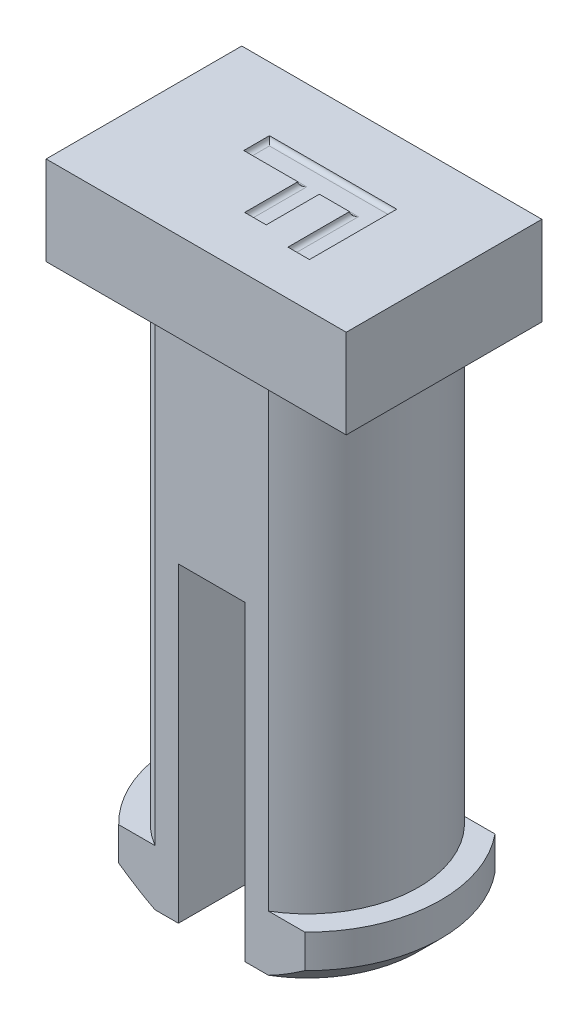
ISO-10303-21;
HEADER;
FILE_DESCRIPTION(('STEP AP214'),'2;1');
FILE_NAME('part.step','',(''),(''),'','','');
FILE_SCHEMA(('AUTOMOTIVE_DESIGN { 1 0 10303 214 1 1 1 1 }'));
ENDSEC;
DATA;
#1=APPLICATION_CONTEXT('core data for automotive mechanical design processes');
#2=APPLICATION_PROTOCOL_DEFINITION('international standard','automotive_design',2000,#1);
#3=PRODUCT_CONTEXT('',#1,'mechanical');
#4=PRODUCT('Part','Part','',(#3));
#5=PRODUCT_RELATED_PRODUCT_CATEGORY('part','',(#4));
#6=PRODUCT_DEFINITION_FORMATION('','',#4);
#7=PRODUCT_DEFINITION_CONTEXT('part definition',#1,'design');
#8=PRODUCT_DEFINITION('design','',#6,#7);
#9=PRODUCT_DEFINITION_SHAPE('','',#8);
#10=(LENGTH_UNIT() NAMED_UNIT(*) SI_UNIT(.MILLI.,.METRE.));
#11=(NAMED_UNIT(*) PLANE_ANGLE_UNIT() SI_UNIT($,.RADIAN.));
#12=(NAMED_UNIT(*) SI_UNIT($,.STERADIAN.) SOLID_ANGLE_UNIT());
#13=UNCERTAINTY_MEASURE_WITH_UNIT(LENGTH_MEASURE(1.E-05),#10,'distance_accuracy_value','');
#14=(GEOMETRIC_REPRESENTATION_CONTEXT(3) GLOBAL_UNCERTAINTY_ASSIGNED_CONTEXT((#13)) GLOBAL_UNIT_ASSIGNED_CONTEXT((#10,
#11,#12)) REPRESENTATION_CONTEXT('',''));
#15=CARTESIAN_POINT('',(0.,0.,0.));
#16=DIRECTION('',(0.,0.,1.));
#17=DIRECTION('',(1.,0.,0.));
#18=AXIS2_PLACEMENT_3D('',#15,#16,#17);
#19=CARTESIAN_POINT('',(3.3750000000002,4.31500000000015,-0.299902035010046));
#20=DIRECTION('',(1.,0.,0.));
#21=DIRECTION('',(0.,-1.,0.));
#22=AXIS2_PLACEMENT_3D('',#19,#20,#21);
#23=PLANE('',#22);
#24=DIRECTION('',(0.,1.,0.));
#25=VECTOR('',#24,1.);
#26=CARTESIAN_POINT('',(3.3750000000002,2.04436866512095,-2.20009796498995));
#27=LINE('',#26,#25);
#28=CARTESIAN_POINT('',(3.3750000000002,4.87500000000014,-2.20009796498995));
#29=VERTEX_POINT('',#28);
#30=CARTESIAN_POINT('',(3.3750000000002,6.87500000000014,-2.20009796498995));
#31=VERTEX_POINT('',#30);
#32=EDGE_CURVE('E419',#29,#31,#27,.T.);
#33=ORIENTED_EDGE('',*,*,#32,.T.);
#34=DIRECTION('',(0.,0.,1.));
#35=VECTOR('',#34,1.);
#36=CARTESIAN_POINT('',(3.3750000000002,6.87500000000014,-2.79990203501005));
#37=LINE('',#36,#35);
#38=CARTESIAN_POINT('',(3.3750000000001,6.87500000000014,2.20009796498994));
#39=VERTEX_POINT('',#38);
#40=EDGE_CURVE('E458',#31,#39,#37,.T.);
#41=ORIENTED_EDGE('',*,*,#40,.T.);
#42=DIRECTION('',(0.,1.,0.));
#43=VECTOR('',#42,1.);
#44=CARTESIAN_POINT('',(3.3750000000001,4.87500000000014,2.20009796498994));
#45=LINE('',#44,#43);
#46=CARTESIAN_POINT('',(3.3750000000002,4.87500000000014,2.20009796498995));
#47=VERTEX_POINT('',#46);
#48=EDGE_CURVE('E11',#47,#39,#45,.T.);
#49=ORIENTED_EDGE('',*,*,#48,.F.);
#50=DIRECTION('',(0.,0.,1.));
#51=VECTOR('',#50,1.);
#52=CARTESIAN_POINT('',(3.3750000000002,4.87500000000014,-2.79990203501005));
#53=LINE('',#52,#51);
#54=EDGE_CURVE('E418',#29,#47,#53,.T.);
#55=ORIENTED_EDGE('',*,*,#54,.F.);
#56=EDGE_LOOP('',(#33,#41,#49,#55));
#57=FACE_BOUND('',#56,.T.);
#58=ADVANCED_FACE('F17',(#57),#23,.T.);
#59=CARTESIAN_POINT('',(4.4100000000002,5.87500000000014,2.20009796498994));
#60=DIRECTION('',(0.,0.,1.));
#61=DIRECTION('',(0.,-1.,0.));
#62=AXIS2_PLACEMENT_3D('',#59,#60,#61);
#63=PLANE('',#62);
#64=DIRECTION('',(-1.,0.,0.));
#65=VECTOR('',#64,1.);
#66=CARTESIAN_POINT('',(3.3750000000001,6.87500000000014,2.20009796498994));
#67=LINE('',#66,#65);
#68=CARTESIAN_POINT('',(-3.3750000000002,6.87500000000014,2.20009796498995));
#69=VERTEX_POINT('',#68);
#70=EDGE_CURVE('E452',#39,#69,#67,.T.);
#71=ORIENTED_EDGE('',*,*,#70,.T.);
#72=DIRECTION('',(0.,1.,0.));
#73=VECTOR('',#72,1.);
#74=CARTESIAN_POINT('',(-3.3750000000002,4.87500000000014,2.20009796498996));
#75=LINE('',#74,#73);
#76=CARTESIAN_POINT('',(-3.3750000000002,4.87500000000014,2.20009796498995));
#77=VERTEX_POINT('',#76);
#78=EDGE_CURVE('E463',#77,#69,#75,.T.);
#79=ORIENTED_EDGE('',*,*,#78,.F.);
#80=DIRECTION('',(-1.,0.,0.));
#81=VECTOR('',#80,1.);
#82=CARTESIAN_POINT('',(3.3750000000002,4.87500000000014,2.20009796498995));
#83=LINE('',#82,#81);
#84=EDGE_CURVE('E511',#47,#77,#83,.T.);
#85=ORIENTED_EDGE('',*,*,#84,.F.);
#86=ORIENTED_EDGE('',*,*,#48,.T.);
#87=EDGE_LOOP('',(#71,#79,#85,#86));
#88=FACE_BOUND('',#87,.T.);
#89=ADVANCED_FACE('F901',(#88),#63,.T.);
#90=CARTESIAN_POINT('',(2.8706971143483,-0.999999999999855,1.85009796498992));
#91=DIRECTION('',(0.,0.,1.));
#92=DIRECTION('',(0.,-1.,0.));
#93=AXIS2_PLACEMENT_3D('',#90,#91,#92);
#94=PLANE('',#93);
#95=DIRECTION('',(0.,1.,0.));
#96=VECTOR('',#95,1.);
#97=CARTESIAN_POINT('',(-1.2757350822175,-5.62499999999985,1.85009796498984));
#98=LINE('',#97,#96);
#99=CARTESIAN_POINT('',(-1.2757350822175,-5.62499999999985,1.85009796498991));
#100=VERTEX_POINT('',#99);
#101=CARTESIAN_POINT('',(-1.2757350822175,4.87500000000014,1.85009796498984));
#102=VERTEX_POINT('',#101);
#103=EDGE_CURVE('E469',#100,#102,#98,.T.);
#104=ORIENTED_EDGE('',*,*,#103,.F.);
#105=DIRECTION('',(1.,0.,0.));
#106=VECTOR('',#105,1.);
#107=CARTESIAN_POINT('',(-2.0922475952909,-5.62499999999985,1.85009796498991));
#108=LINE('',#107,#106);
#109=CARTESIAN_POINT('',(-2.0922475952909,-5.62499999999985,1.85009796498992));
#110=VERTEX_POINT('',#109);
#111=EDGE_CURVE('E325',#110,#100,#108,.T.);
#112=ORIENTED_EDGE('',*,*,#111,.F.);
#113=DIRECTION('',(0.,1.,0.));
#114=VECTOR('',#113,1.);
#115=CARTESIAN_POINT('',(-2.0922475952909,-6.37499999999985,1.85009796498992));
#116=LINE('',#115,#114);
#117=CARTESIAN_POINT('',(-2.0922475952909,-6.37499999999985,1.85009796498994));
#118=VERTEX_POINT('',#117);
#119=EDGE_CURVE('E183',#118,#110,#116,.T.);
#120=ORIENTED_EDGE('',*,*,#119,.F.);
#121=CARTESIAN_POINT('',(-1.27573508221749,-6.87499999999999,1.85009796498994));
#122=CARTESIAN_POINT('',(-1.64687713360691,-6.68560842582256,1.85009796498994));
#123=CARTESIAN_POINT('',(-2.09224759527229,-6.37500000001307,1.85009796498994));
#124=(BOUNDED_CURVE() B_SPLINE_CURVE(2,(#121,#122,#123),.UNSPECIFIED.,.F.,
.F.) B_SPLINE_CURVE_WITH_KNOTS((3,3),(2.63089652868955,2.93477671960764),
.UNSPECIFIED.) CURVE() GEOMETRIC_REPRESENTATION_ITEM() RATIONAL_B_SPLINE_CURVE((3.74193548387105,
3.59549330391969,3.37864077670762)) REPRESENTATION_ITEM(''));
#125=CARTESIAN_POINT('',(-1.2757350822175,-6.87499999999985,1.85009796498989));
#126=VERTEX_POINT('',#125);
#127=EDGE_CURVE('E486',#126,#118,#124,.T.);
#128=ORIENTED_EDGE('',*,*,#127,.F.);
#129=DIRECTION('',(-1.,0.,0.));
#130=VECTOR('',#129,1.);
#131=CARTESIAN_POINT('',(-0.749999999999799,-6.87499999999985,1.85009796498992));
#132=LINE('',#131,#130);
#133=CARTESIAN_POINT('',(-0.749999999999799,-6.87499999999985,1.85009796498992));
#134=VERTEX_POINT('',#133);
#135=EDGE_CURVE('E402',#134,#126,#132,.T.);
#136=ORIENTED_EDGE('',*,*,#135,.F.);
#137=DIRECTION('',(0.,-1.,0.));
#138=VECTOR('',#137,1.);
#139=CARTESIAN_POINT('',(-0.749999999999799,0.125000000000146,1.85009796498992));
#140=LINE('',#139,#138);
#141=CARTESIAN_POINT('',(-0.749999999999799,0.125000000000146,1.85009796498992));
#142=VERTEX_POINT('',#141);
#143=EDGE_CURVE('E497',#142,#134,#140,.T.);
#144=ORIENTED_EDGE('',*,*,#143,.F.);
#145=DIRECTION('',(-1.,0.,0.));
#146=VECTOR('',#145,1.);
#147=CARTESIAN_POINT('',(0.750000000000202,0.125000000000146,1.85009796498992));
#148=LINE('',#147,#146);
#149=CARTESIAN_POINT('',(0.750000000000202,0.125000000000146,1.85009796498992));
#150=VERTEX_POINT('',#149);
#151=EDGE_CURVE('E520',#150,#142,#148,.T.);
#152=ORIENTED_EDGE('',*,*,#151,.F.);
#153=DIRECTION('',(0.,1.,0.));
#154=VECTOR('',#153,1.);
#155=CARTESIAN_POINT('',(0.750000000000202,-6.87499999999985,1.85009796498992));
#156=LINE('',#155,#154);
#157=CARTESIAN_POINT('',(0.750000000000202,-6.87499999999985,1.85009796498997));
#158=VERTEX_POINT('',#157);
#159=EDGE_CURVE('E72',#158,#150,#156,.T.);
#160=ORIENTED_EDGE('',*,*,#159,.F.);
#161=DIRECTION('',(-1.,0.,0.));
#162=VECTOR('',#161,1.);
#163=CARTESIAN_POINT('',(1.2757350822172,-6.87499999999985,1.85009796498997));
#164=LINE('',#163,#162);
#165=CARTESIAN_POINT('',(1.2757350822172,-6.87499999999985,1.85009796498997));
#166=VERTEX_POINT('',#165);
#167=EDGE_CURVE('E369',#166,#158,#164,.T.);
#168=ORIENTED_EDGE('',*,*,#167,.F.);
#169=CARTESIAN_POINT('',(2.09224759527189,-6.37500000001286,1.85009796498995));
#170=CARTESIAN_POINT('',(1.64687713360649,-6.68560842582246,1.85009796498995));
#171=CARTESIAN_POINT('',(1.2757350822171,-6.87499999999985,1.85009796498995));
#172=(BOUNDED_CURVE() B_SPLINE_CURVE(2,(#169,#170,#171),.UNSPECIFIED.,.F.,
.F.) B_SPLINE_CURVE_WITH_KNOTS((3,3),(1.06297264722392,1.36685283814203),
.UNSPECIFIED.) CURVE() GEOMETRIC_REPRESENTATION_ITEM() RATIONAL_B_SPLINE_CURVE((3.3786407767078,
3.59549330391984,3.74193548387118)) REPRESENTATION_ITEM(''));
#173=CARTESIAN_POINT('',(2.0922475952905,-6.37500000000005,1.85009796499042));
#174=VERTEX_POINT('',#173);
#175=EDGE_CURVE('E519',#174,#166,#172,.T.);
#176=ORIENTED_EDGE('',*,*,#175,.F.);
#177=DIRECTION('',(0.,-1.,0.));
#178=VECTOR('',#177,1.);
#179=CARTESIAN_POINT('',(2.0922475952905,-5.62499999999985,1.85009796499042));
#180=LINE('',#179,#178);
#181=CARTESIAN_POINT('',(2.0922475952905,-5.62499999999985,1.85009796499042));
#182=VERTEX_POINT('',#181);
#183=EDGE_CURVE('E504',#182,#174,#180,.T.);
#184=ORIENTED_EDGE('',*,*,#183,.F.);
#185=DIRECTION('',(1.,0.,0.));
#186=VECTOR('',#185,1.);
#187=CARTESIAN_POINT('',(1.2757350822172,-5.62499999999985,1.85009796498998));
#188=LINE('',#187,#186);
#189=CARTESIAN_POINT('',(1.2757350822172,-5.62499999999985,1.85009796498998));
#190=VERTEX_POINT('',#189);
#191=EDGE_CURVE('E440',#190,#182,#188,.T.);
#192=ORIENTED_EDGE('',*,*,#191,.F.);
#193=DIRECTION('',(0.,-1.,0.));
#194=VECTOR('',#193,1.);
#195=CARTESIAN_POINT('',(1.2757350822173,4.87500000000014,1.85009796499007));
#196=LINE('',#195,#194);
#197=CARTESIAN_POINT('',(1.2757350822173,4.87500000000014,1.85009796499007));
#198=VERTEX_POINT('',#197);
#199=EDGE_CURVE('E88',#198,#190,#196,.T.);
#200=ORIENTED_EDGE('',*,*,#199,.F.);
#201=DIRECTION('',(-1.,0.,0.));
#202=VECTOR('',#201,1.);
#203=CARTESIAN_POINT('',(1.2757350822172,4.87500000000014,1.85009796498992));
#204=LINE('',#203,#202);
#205=EDGE_CURVE('E27',#198,#102,#204,.T.);
#206=ORIENTED_EDGE('',*,*,#205,.T.);
#207=EDGE_LOOP('',(#104,#112,#120,#128,#136,#144,#152,#160,#168,#176,#184,#192,#200,#206));
#208=FACE_BOUND('',#207,.T.);
#209=ADVANCED_FACE('F904',(#208),#94,.T.);
#210=CARTESIAN_POINT('',(-2.1753675411088,4.87500000000014,-3.23990203501003));
#211=DIRECTION('',(0.,-1.,0.));
#212=DIRECTION('',(-1.,0.,0.));
#213=AXIS2_PLACEMENT_3D('',#210,#211,#212);
#214=PLANE('',#213);
#215=DIRECTION('',(1.,0.,0.));
#216=VECTOR('',#215,1.);
#217=CARTESIAN_POINT('',(0.675099267685303,4.87500000000014,-2.20009796498995));
#218=LINE('',#217,#216);
#219=CARTESIAN_POINT('',(1.6245785384796,4.87500000000014,-2.20009796498995));
#220=VERTEX_POINT('',#219);
#221=EDGE_CURVE('E424',#220,#29,#218,.T.);
#222=ORIENTED_EDGE('',*,*,#221,.T.);
#223=ORIENTED_EDGE('',*,*,#54,.T.);
#224=ORIENTED_EDGE('',*,*,#84,.T.);
#225=DIRECTION('',(0.,0.,-1.));
#226=VECTOR('',#225,1.);
#227=CARTESIAN_POINT('',(-3.3750000000002,4.87500000000014,2.20009796498996));
#228=LINE('',#227,#226);
#229=CARTESIAN_POINT('',(-3.3750000000002,4.87500000000014,-2.20009796498995));
#230=VERTEX_POINT('',#229);
#231=EDGE_CURVE('E461',#77,#230,#228,.T.);
#232=ORIENTED_EDGE('',*,*,#231,.T.);
#233=DIRECTION('',(1.,0.,0.));
#234=VECTOR('',#233,1.);
#235=CARTESIAN_POINT('',(0.675099267685303,4.87500000000014,-2.20009796498995));
#236=LINE('',#235,#234);
#237=CARTESIAN_POINT('',(-1.6245785384795,4.87500000000014,-2.20009796498995));
#238=VERTEX_POINT('',#237);
#239=EDGE_CURVE('E395',#230,#238,#236,.T.);
#240=ORIENTED_EDGE('',*,*,#239,.T.);
#241=CARTESIAN_POINT('',(-3.98986399474666E-13,4.87500000000014,-0.299902035010056));
#242=DIRECTION('',(0.,-1.,0.));
#243=DIRECTION('',(-0.510294032886866,0.,-0.860000000000034));
#244=AXIS2_PLACEMENT_3D('',#241,#242,#243);
#245=CIRCLE('',#244,2.4999999999998);
#246=EDGE_CURVE('E475',#102,#238,#245,.T.);
#247=ORIENTED_EDGE('',*,*,#246,.F.);
#248=ORIENTED_EDGE('',*,*,#205,.F.);
#249=CARTESIAN_POINT('',(2.0122792321331E-13,4.87500000000014,-0.299902035010056));
#250=DIRECTION('',(0.,-1.,0.));
#251=DIRECTION('',(0.510294032886823,0.,0.86000000000006));
#252=AXIS2_PLACEMENT_3D('',#249,#250,#251);
#253=CIRCLE('',#252,2.5);
#254=EDGE_CURVE('E524',#220,#198,#253,.T.);
#255=ORIENTED_EDGE('',*,*,#254,.F.);
#256=EDGE_LOOP('',(#222,#223,#224,#232,#240,#247,#248,#255));
#257=FACE_BOUND('',#256,.T.);
#258=ADVANCED_FACE('F917',(#257),#214,.T.);
#259=CARTESIAN_POINT('',(0.750000000000202,-7.93499999999985,-0.299902035010056));
#260=DIRECTION('',(-1.,0.,0.));
#261=DIRECTION('',(0.,0.,1.));
#262=AXIS2_PLACEMENT_3D('',#259,#260,#261);
#263=PLANE('',#262);
#264=DIRECTION('',(0.,-1.,0.));
#265=VECTOR('',#264,1.);
#266=CARTESIAN_POINT('',(0.750000000000202,-4.08063133487905,-2.20009796498995));
#267=LINE('',#266,#265);
#268=CARTESIAN_POINT('',(0.750000000000202,0.125000000000146,-2.20009796498995));
#269=VERTEX_POINT('',#268);
#270=CARTESIAN_POINT('',(0.750000000000202,-6.87499999999985,-2.20009796498995));
#271=VERTEX_POINT('',#270);
#272=EDGE_CURVE('E357',#269,#271,#267,.T.);
#273=ORIENTED_EDGE('',*,*,#272,.T.);
#274=DIRECTION('',(0.,0.,-1.));
#275=VECTOR('',#274,1.);
#276=CARTESIAN_POINT('',(0.750000000000202,-6.87499999999985,1.85009796498992));
#277=LINE('',#276,#275);
#278=EDGE_CURVE('E373',#158,#271,#277,.T.);
#279=ORIENTED_EDGE('',*,*,#278,.F.);
#280=ORIENTED_EDGE('',*,*,#159,.T.);
#281=DIRECTION('',(0.,0.,1.));
#282=VECTOR('',#281,1.);
#283=CARTESIAN_POINT('',(0.750000000000202,0.125000000000146,-2.44990203501003));
#284=LINE('',#283,#282);
#285=EDGE_CURVE('E513',#269,#150,#284,.T.);
#286=ORIENTED_EDGE('',*,*,#285,.F.);
#287=EDGE_LOOP('',(#273,#279,#280,#286));
#288=FACE_BOUND('',#287,.T.);
#289=ADVANCED_FACE('F936',(#288),#263,.T.);
#290=CARTESIAN_POINT('',(2.0122792321331E-13,-6.67619999999975,-0.299902035010416));
#291=DIRECTION('',(0.,-1.,0.));
#292=DIRECTION('',(0.,0.,1.));
#293=AXIS2_PLACEMENT_3D('',#290,#291,#292);
#294=CYLINDRICAL_SURFACE('',#293,2.50000000000035);
#295=DIRECTION('',(0.,1.,0.));
#296=VECTOR('',#295,1.);
#297=CARTESIAN_POINT('',(1.6245785384806,-6.67619999999975,-2.20009796498995));
#298=LINE('',#297,#296);
#299=CARTESIAN_POINT('',(1.6245785384795,-5.62499999999985,-2.20009796498995));
#300=VERTEX_POINT('',#299);
#301=EDGE_CURVE('E428',#300,#220,#298,.T.);
#302=ORIENTED_EDGE('',*,*,#301,.T.);
#303=ORIENTED_EDGE('',*,*,#254,.T.);
#304=ORIENTED_EDGE('',*,*,#199,.T.);
#305=CARTESIAN_POINT('',(3.98986399474666E-13,-5.62499999999985,-0.299902035010056));
#306=DIRECTION('',(0.,-1.,0.));
#307=DIRECTION('',(0.510294032886748,0.,0.860000000000104));
#308=AXIS2_PLACEMENT_3D('',#305,#306,#307);
#309=CIRCLE('',#308,2.49999999999975);
#310=EDGE_CURVE('E433',#300,#190,#309,.T.);
#311=ORIENTED_EDGE('',*,*,#310,.F.);
#312=EDGE_LOOP('',(#302,#303,#304,#311));
#313=FACE_BOUND('',#312,.T.);
#314=ADVANCED_FACE('F922',(#313),#294,.T.);
#315=CARTESIAN_POINT('',(2.0122792321331E-13,-9.04487999999985,-0.299902035010066));
#316=DIRECTION('',(-1.00968571592498E-13,1.,0.));
#317=DIRECTION('',(0.996311320213211,1.00710866506472E-13,0.0858123138891406));
#318=AXIS2_PLACEMENT_3D('',#315,#316,#317);
#319=CONICAL_SURFACE('',#318,0.330119999999992,0.785398163397457);
#320=CARTESIAN_POINT('',(1.6245785384788,-6.87500000000015,-2.20009796498995));
#321=CARTESIAN_POINT('',(1.94135056313009,-6.66915158686443,-2.20009796498995));
#322=CARTESIAN_POINT('',(2.3214769927109,-6.37499999999995,-2.20009796498995));
#323=(BOUNDED_CURVE() B_SPLINE_CURVE(2,(#320,#321,#322),.UNSPECIFIED.,.F.,
.F.) B_SPLINE_CURVE_WITH_KNOTS((3,3),(0.,0.0857889296771792),
.UNSPECIFIED.) CURVE() GEOMETRIC_REPRESENTATION_ITEM() RATIONAL_B_SPLINE_CURVE((1.,
1.0081255355786,1.)) REPRESENTATION_ITEM(''));
#324=CARTESIAN_POINT('',(1.6245785384794,-6.87499999999985,-2.20009796498995));
#325=VERTEX_POINT('',#324);
#326=CARTESIAN_POINT('',(2.3214769927115,-6.37500000000005,-2.20009796498995));
#327=VERTEX_POINT('',#326);
#328=EDGE_CURVE('E445',#325,#327,#323,.T.);
#329=ORIENTED_EDGE('',*,*,#328,.T.);
#330=CARTESIAN_POINT('',(2.0122792321331E-13,-6.37500000000005,-0.299902035010076));
#331=DIRECTION('',(0.,1.,0.));
#332=DIRECTION('',(0.697415865096755,0.,-0.716666666666829));
#333=AXIS2_PLACEMENT_3D('',#330,#331,#332);
#334=CIRCLE('',#333,3.);
#335=EDGE_CURVE('E397',#174,#327,#334,.T.);
#336=ORIENTED_EDGE('',*,*,#335,.F.);
#337=ORIENTED_EDGE('',*,*,#175,.T.);
#338=CARTESIAN_POINT('',(4.9960036108132E-13,-6.87499999999985,-0.299902035010056));
#339=DIRECTION('',(0.,-1.,0.));
#340=DIRECTION('',(0.510294032886745,0.,0.860000000000106));
#341=AXIS2_PLACEMENT_3D('',#338,#339,#340);
#342=CIRCLE('',#341,2.49999999999973);
#343=EDGE_CURVE('E372',#325,#166,#342,.T.);
#344=ORIENTED_EDGE('',*,*,#343,.F.);
#345=EDGE_LOOP('',(#329,#336,#337,#344));
#346=FACE_BOUND('',#345,.T.);
#347=ADVANCED_FACE('F934',(#346),#319,.T.);
#348=CARTESIAN_POINT('',(2.0122792321331E-13,0.125000000000146,-3.23990203501003));
#349=DIRECTION('',(0.,-1.,0.));
#350=DIRECTION('',(-1.,0.,0.));
#351=AXIS2_PLACEMENT_3D('',#348,#349,#350);
#352=PLANE('',#351);
#353=DIRECTION('',(1.,0.,0.));
#354=VECTOR('',#353,1.);
#355=CARTESIAN_POINT('',(1.7627830382399,0.125000000000146,-2.20009796498995));
#356=LINE('',#355,#354);
#357=CARTESIAN_POINT('',(-0.749999999999799,0.125000000000146,-2.20009796498995));
#358=VERTEX_POINT('',#357);
#359=EDGE_CURVE('E349',#358,#269,#356,.T.);
#360=ORIENTED_EDGE('',*,*,#359,.T.);
#361=ORIENTED_EDGE('',*,*,#285,.T.);
#362=ORIENTED_EDGE('',*,*,#151,.T.);
#363=DIRECTION('',(0.,0.,-1.));
#364=VECTOR('',#363,1.);
#365=CARTESIAN_POINT('',(-0.749999999999799,0.125000000000146,1.85009796498992));
#366=LINE('',#365,#364);
#367=EDGE_CURVE('E407',#142,#358,#366,.T.);
#368=ORIENTED_EDGE('',*,*,#367,.T.);
#369=EDGE_LOOP('',(#360,#361,#362,#368));
#370=FACE_BOUND('',#369,.T.);
#371=ADVANCED_FACE('F942',(#370),#352,.T.);
#372=CARTESIAN_POINT('',(2.1378675411087,-5.62499999999985,-3.23990203501028));
#373=DIRECTION('',(0.,1.,0.));
#374=DIRECTION('',(0.,0.,-1.));
#375=AXIS2_PLACEMENT_3D('',#372,#373,#374);
#376=PLANE('',#375);
#377=DIRECTION('',(-1.,0.,0.));
#378=VECTOR('',#377,1.);
#379=CARTESIAN_POINT('',(2.8317168087941,-5.62499999999985,-2.20009796498995));
#380=LINE('',#379,#378);
#381=CARTESIAN_POINT('',(2.3214769927115,-5.62499999999985,-2.20009796498995));
#382=VERTEX_POINT('',#381);
#383=EDGE_CURVE('E435',#382,#300,#380,.T.);
#384=ORIENTED_EDGE('',*,*,#383,.T.);
#385=ORIENTED_EDGE('',*,*,#310,.T.);
#386=ORIENTED_EDGE('',*,*,#191,.T.);
#387=CARTESIAN_POINT('',(2.0122792321331E-13,-5.62499999999985,-0.299902035010066));
#388=DIRECTION('',(0.,-1.,0.));
#389=DIRECTION('',(0.697415865096753,0.,0.716666666666831));
#390=AXIS2_PLACEMENT_3D('',#387,#388,#389);
#391=CIRCLE('',#390,3.);
#392=EDGE_CURVE('E496',#382,#182,#391,.T.);
#393=ORIENTED_EDGE('',*,*,#392,.F.);
#394=EDGE_LOOP('',(#384,#385,#386,#393));
#395=FACE_BOUND('',#394,.T.);
#396=ADVANCED_FACE('F926',(#395),#376,.T.);
#397=CARTESIAN_POINT('',(1.6250000000002,-6.87499999999985,-3.2399020350101));
#398=DIRECTION('',(0.,-1.,0.));
#399=DIRECTION('',(-1.,0.,0.));
#400=AXIS2_PLACEMENT_3D('',#397,#398,#399);
#401=PLANE('',#400);
#402=DIRECTION('',(1.,0.,0.));
#403=VECTOR('',#402,1.);
#404=CARTESIAN_POINT('',(2.5752830382399,-6.87499999999985,-2.20009796498995));
#405=LINE('',#404,#403);
#406=EDGE_CURVE('E365',#271,#325,#405,.T.);
#407=ORIENTED_EDGE('',*,*,#406,.T.);
#408=ORIENTED_EDGE('',*,*,#343,.T.);
#409=ORIENTED_EDGE('',*,*,#167,.T.);
#410=ORIENTED_EDGE('',*,*,#278,.T.);
#411=EDGE_LOOP('',(#407,#408,#409,#410));
#412=FACE_BOUND('',#411,.T.);
#413=ADVANCED_FACE('F940',(#412),#401,.T.);
#414=CARTESIAN_POINT('',(2.0122792321331E-13,-6.45119999999985,-0.299902035010406));
#415=DIRECTION('',(0.,-1.,0.));
#416=DIRECTION('',(0.,0.,1.));
#417=AXIS2_PLACEMENT_3D('',#414,#415,#416);
#418=CYLINDRICAL_SURFACE('',#417,3.00000000000034);
#419=DIRECTION('',(0.,1.,0.));
#420=VECTOR('',#419,1.);
#421=CARTESIAN_POINT('',(2.3214769927122,-6.45119999999985,-2.20009796498995));
#422=LINE('',#421,#420);
#423=EDGE_CURVE('E442',#327,#382,#422,.T.);
#424=ORIENTED_EDGE('',*,*,#423,.T.);
#425=ORIENTED_EDGE('',*,*,#392,.T.);
#426=ORIENTED_EDGE('',*,*,#183,.T.);
#427=ORIENTED_EDGE('',*,*,#335,.T.);
#428=EDGE_LOOP('',(#424,#425,#426,#427));
#429=FACE_BOUND('',#428,.T.);
#430=ADVANCED_FACE('F927',(#429),#418,.T.);
#431=CARTESIAN_POINT('',(-0.749999999999799,-7.93499999999985,-0.299902035010056));
#432=DIRECTION('',(1.,0.,0.));
#433=DIRECTION('',(0.,-1.,0.));
#434=AXIS2_PLACEMENT_3D('',#431,#432,#433);
#435=PLANE('',#434);
#436=DIRECTION('',(0.,1.,0.));
#437=VECTOR('',#436,1.);
#438=CARTESIAN_POINT('',(-0.749999999999799,-4.08063133487905,-2.20009796498995));
#439=LINE('',#438,#437);
#440=CARTESIAN_POINT('',(-0.749999999999799,-6.87499999999985,-2.20009796498995));
#441=VERTEX_POINT('',#440);
#442=EDGE_CURVE('E353',#441,#358,#439,.T.);
#443=ORIENTED_EDGE('',*,*,#442,.T.);
#444=ORIENTED_EDGE('',*,*,#367,.F.);
#445=ORIENTED_EDGE('',*,*,#143,.T.);
#446=DIRECTION('',(0.,0.,1.));
#447=VECTOR('',#446,1.);
#448=CARTESIAN_POINT('',(-0.749999999999799,-6.87499999999985,-2.44990203501003));
#449=LINE('',#448,#447);
#450=EDGE_CURVE('E408',#441,#134,#449,.T.);
#451=ORIENTED_EDGE('',*,*,#450,.F.);
#452=EDGE_LOOP('',(#443,#444,#445,#451));
#453=FACE_BOUND('',#452,.T.);
#454=ADVANCED_FACE('F946',(#453),#435,.T.);
#455=CARTESIAN_POINT('',(-1.625,-6.87499999999985,-3.23990203501003));
#456=DIRECTION('',(0.,-1.,0.));
#457=DIRECTION('',(-1.,0.,0.));
#458=AXIS2_PLACEMENT_3D('',#455,#456,#457);
#459=PLANE('',#458);
#460=DIRECTION('',(1.,0.,0.));
#461=VECTOR('',#460,1.);
#462=CARTESIAN_POINT('',(0.950283038239701,-6.87499999999985,-2.20009796498995));
#463=LINE('',#462,#461);
#464=CARTESIAN_POINT('',(-1.6245785384796,-6.87499999999985,-2.20009796498995));
#465=VERTEX_POINT('',#464);
#466=EDGE_CURVE('E358',#465,#441,#463,.T.);
#467=ORIENTED_EDGE('',*,*,#466,.T.);
#468=ORIENTED_EDGE('',*,*,#450,.T.);
#469=ORIENTED_EDGE('',*,*,#135,.T.);
#470=CARTESIAN_POINT('',(-2.98372437868011E-13,-6.87499999999985,-0.299902035010056));
#471=DIRECTION('',(0.,1.,0.));
#472=DIRECTION('',(-0.510294032886918,0.,0.86));
#473=AXIS2_PLACEMENT_3D('',#470,#471,#472);
#474=CIRCLE('',#473,2.49999999999993);
#475=EDGE_CURVE('E485',#465,#126,#474,.T.);
#476=ORIENTED_EDGE('',*,*,#475,.F.);
#477=EDGE_LOOP('',(#467,#468,#469,#476));
#478=FACE_BOUND('',#477,.T.);
#479=ADVANCED_FACE('F955',(#478),#459,.T.);
#480=CARTESIAN_POINT('',(2.0122792321331E-13,-9.04487999999985,-0.299902035010066));
#481=DIRECTION('',(-1.00968571592498E-13,1.,0.));
#482=DIRECTION('',(-0.581108581114928,0.,-0.813826036051069));
#483=AXIS2_PLACEMENT_3D('',#480,#481,#482);
#484=CONICAL_SURFACE('',#483,0.330119999999992,0.785398163397457);
#485=CARTESIAN_POINT('',(-2.3214769927119,-6.37499999999985,-2.20009796498995));
#486=CARTESIAN_POINT('',(-1.94135056313139,-6.66915158686402,-2.20009796498995));
#487=CARTESIAN_POINT('',(-1.6245785384796,-6.87499999999995,-2.20009796498995));
#488=(BOUNDED_CURVE() B_SPLINE_CURVE(2,(#485,#486,#487),.UNSPECIFIED.,.F.,
.F.) B_SPLINE_CURVE_WITH_KNOTS((3,3),(0.,0.0857889296771956),
.UNSPECIFIED.) CURVE() GEOMETRIC_REPRESENTATION_ITEM() RATIONAL_B_SPLINE_CURVE((1.,
1.00812553556989,1.)) REPRESENTATION_ITEM(''));
#489=CARTESIAN_POINT('',(-2.3214769927115,-6.37499999999985,-2.20009796498995));
#490=VERTEX_POINT('',#489);
#491=EDGE_CURVE('E366',#490,#465,#488,.T.);
#492=ORIENTED_EDGE('',*,*,#491,.T.);
#493=ORIENTED_EDGE('',*,*,#475,.T.);
#494=ORIENTED_EDGE('',*,*,#127,.T.);
#495=CARTESIAN_POINT('',(-4.9960036108132E-13,-6.37499999999995,-0.299902035010066));
#496=DIRECTION('',(0.,-1.,0.));
#497=DIRECTION('',(-0.697415865096868,0.,-0.71666666666672));
#498=AXIS2_PLACEMENT_3D('',#495,#496,#497);
#499=CIRCLE('',#498,2.99999999999978);
#500=EDGE_CURVE('E317',#118,#490,#499,.T.);
#501=ORIENTED_EDGE('',*,*,#500,.T.);
#502=EDGE_LOOP('',(#492,#493,#494,#501));
#503=FACE_BOUND('',#502,.T.);
#504=ADVANCED_FACE('F954',(#503),#484,.T.);
#505=CARTESIAN_POINT('',(2.0122792321331E-13,-6.45119999999985,-0.299902035010406));
#506=DIRECTION('',(0.,-1.,0.));
#507=DIRECTION('',(0.,0.,1.));
#508=AXIS2_PLACEMENT_3D('',#505,#506,#507);
#509=CYLINDRICAL_SURFACE('',#508,3.00000000000034);
#510=DIRECTION('',(0.,-1.,0.));
#511=VECTOR('',#510,1.);
#512=CARTESIAN_POINT('',(-2.3214769927118,-6.45119999999985,-2.20009796498995));
#513=LINE('',#512,#511);
#514=CARTESIAN_POINT('',(-2.3214769927114,-5.62499999999985,-2.20009796498995));
#515=VERTEX_POINT('',#514);
#516=EDGE_CURVE('E379',#515,#490,#513,.T.);
#517=ORIENTED_EDGE('',*,*,#516,.T.);
#518=ORIENTED_EDGE('',*,*,#500,.F.);
#519=ORIENTED_EDGE('',*,*,#119,.T.);
#520=CARTESIAN_POINT('',(-4.9960036108132E-13,-5.62499999999985,-0.299902035010046));
#521=DIRECTION('',(0.,-1.,0.));
#522=DIRECTION('',(-0.69741586509687,0.,-0.716666666666718));
#523=AXIS2_PLACEMENT_3D('',#520,#521,#522);
#524=CIRCLE('',#523,2.99999999999974);
#525=EDGE_CURVE('E480',#110,#515,#524,.T.);
#526=ORIENTED_EDGE('',*,*,#525,.T.);
#527=EDGE_LOOP('',(#517,#518,#519,#526));
#528=FACE_BOUND('',#527,.T.);
#529=ADVANCED_FACE('F956',(#528),#509,.T.);
#530=CARTESIAN_POINT('',(-2.1378675411088,-5.62499999999985,-3.23990203501003));
#531=DIRECTION('',(0.,1.,0.));
#532=DIRECTION('',(0.,0.,-1.));
#533=AXIS2_PLACEMENT_3D('',#530,#531,#532);
#534=PLANE('',#533);
#535=DIRECTION('',(-1.,0.,0.));
#536=VECTOR('',#535,1.);
#537=CARTESIAN_POINT('',(0.693849267685401,-5.62499999999985,-2.20009796498995));
#538=LINE('',#537,#536);
#539=CARTESIAN_POINT('',(-1.6245785384795,-5.62499999999985,-2.20009796498995));
#540=VERTEX_POINT('',#539);
#541=EDGE_CURVE('E390',#540,#515,#538,.T.);
#542=ORIENTED_EDGE('',*,*,#541,.T.);
#543=ORIENTED_EDGE('',*,*,#525,.F.);
#544=ORIENTED_EDGE('',*,*,#111,.T.);
#545=CARTESIAN_POINT('',(-2.98372437868011E-13,-5.62499999999985,-0.299902035010056));
#546=DIRECTION('',(0.,-1.,0.));
#547=DIRECTION('',(-0.510294032886886,0.,-0.860000000000022));
#548=AXIS2_PLACEMENT_3D('',#545,#546,#547);
#549=CIRCLE('',#548,2.49999999999988);
#550=EDGE_CURVE('E470',#100,#540,#549,.T.);
#551=ORIENTED_EDGE('',*,*,#550,.T.);
#552=EDGE_LOOP('',(#542,#543,#544,#551));
#553=FACE_BOUND('',#552,.T.);
#554=ADVANCED_FACE('F961',(#553),#534,.T.);
#555=CARTESIAN_POINT('',(2.0122792321331E-13,-6.67619999999975,-0.299902035010416));
#556=DIRECTION('',(0.,-1.,0.));
#557=DIRECTION('',(0.,0.,1.));
#558=AXIS2_PLACEMENT_3D('',#555,#556,#557);
#559=CYLINDRICAL_SURFACE('',#558,2.50000000000035);
#560=DIRECTION('',(0.,-1.,0.));
#561=VECTOR('',#560,1.);
#562=CARTESIAN_POINT('',(-1.6245785384802,-6.67619999999975,-2.20009796498995));
#563=LINE('',#562,#561);
#564=EDGE_CURVE('E391',#238,#540,#563,.T.);
#565=ORIENTED_EDGE('',*,*,#564,.T.);
#566=ORIENTED_EDGE('',*,*,#550,.F.);
#567=ORIENTED_EDGE('',*,*,#103,.T.);
#568=ORIENTED_EDGE('',*,*,#246,.T.);
#569=EDGE_LOOP('',(#565,#566,#567,#568));
#570=FACE_BOUND('',#569,.T.);
#571=ADVANCED_FACE('F962',(#570),#559,.T.);
#572=CARTESIAN_POINT('',(-3.3750000000002,4.31500000000015,-0.299902035010036));
#573=DIRECTION('',(-1.,0.,0.));
#574=DIRECTION('',(0.,0.,1.));
#575=AXIS2_PLACEMENT_3D('',#572,#573,#574);
#576=PLANE('',#575);
#577=DIRECTION('',(0.,-1.,0.));
#578=VECTOR('',#577,1.);
#579=CARTESIAN_POINT('',(-3.3750000000002,2.04436866512095,-2.20009796498995));
#580=LINE('',#579,#578);
#581=CARTESIAN_POINT('',(-3.3750000000002,6.87500000000014,-2.20009796498995));
#582=VERTEX_POINT('',#581);
#583=EDGE_CURVE('E403',#582,#230,#580,.T.);
#584=ORIENTED_EDGE('',*,*,#583,.T.);
#585=ORIENTED_EDGE('',*,*,#231,.F.);
#586=ORIENTED_EDGE('',*,*,#78,.T.);
#587=DIRECTION('',(0.,0.,-1.));
#588=VECTOR('',#587,1.);
#589=CARTESIAN_POINT('',(-3.3750000000002,6.87500000000014,2.20009796498995));
#590=LINE('',#589,#588);
#591=EDGE_CURVE('E361',#69,#582,#590,.T.);
#592=ORIENTED_EDGE('',*,*,#591,.T.);
#593=EDGE_LOOP('',(#584,#585,#586,#592));
#594=FACE_BOUND('',#593,.T.);
#595=ADVANCED_FACE('F968',(#594),#576,.T.);
#596=CARTESIAN_POINT('',(0.,6.87500000000014,-3.23990203501004));
#597=DIRECTION('',(0.,1.,0.));
#598=DIRECTION('',(0.,0.,-1.));
#599=AXIS2_PLACEMENT_3D('',#596,#597,#598);
#600=PLANE('',#599);
#601=DIRECTION('',(-1.,0.,0.));
#602=VECTOR('',#601,1.);
#603=CARTESIAN_POINT('',(-0.0501659079302982,6.87500000000014,-0.186748345270606));
#604=LINE('',#603,#602);
#605=CARTESIAN_POINT('',(-0.100331815860499,6.87500000000014,-0.186748345270606));
#606=VERTEX_POINT('',#605);
#607=CARTESIAN_POINT('',(-1.3171287504652,6.87500000000014,-0.186748345270606));
#608=VERTEX_POINT('',#607);
#609=EDGE_CURVE('E780',#606,#608,#604,.T.);
#610=ORIENTED_EDGE('',*,*,#609,.T.);
#611=DIRECTION('',(0.,0.,-1.));
#612=VECTOR('',#611,1.);
#613=CARTESIAN_POINT('',(-1.3171287504652,6.87500000000014,-1.71332519014032));
#614=LINE('',#613,#612);
#615=CARTESIAN_POINT('',(-1.3171287504652,6.87500000000014,-0.764873371347636));
#616=VERTEX_POINT('',#615);
#617=EDGE_CURVE('E775',#608,#616,#614,.T.);
#618=ORIENTED_EDGE('',*,*,#617,.T.);
#619=DIRECTION('',(1.,0.,0.));
#620=VECTOR('',#619,1.);
#621=CARTESIAN_POINT('',(-0.658564375232599,6.87500000000014,-0.764873371347636));
#622=LINE('',#621,#620);
#623=CARTESIAN_POINT('',(1.5461526187441,6.87500000000014,-0.764873371347636));
#624=VERTEX_POINT('',#623);
#625=EDGE_CURVE('E304',#616,#624,#622,.T.);
#626=ORIENTED_EDGE('',*,*,#625,.T.);
#627=DIRECTION('',(0.,0.,1.));
#628=VECTOR('',#627,1.);
#629=CARTESIAN_POINT('',(1.5461526187441,6.87500000000014,-2.00238770317884));
#630=LINE('',#629,#628);
#631=CARTESIAN_POINT('',(1.5461526187441,6.87500000000014,1.19801738403752));
#632=VERTEX_POINT('',#631);
#633=EDGE_CURVE('E277',#624,#632,#630,.T.);
#634=ORIENTED_EDGE('',*,*,#633,.T.);
#635=DIRECTION('',(-1.,0.,0.));
#636=VECTOR('',#635,1.);
#637=CARTESIAN_POINT('',(0.773076309372001,6.87500000000014,1.19801738403752));
#638=LINE('',#637,#636);
#639=CARTESIAN_POINT('',(1.0617775591395,6.87500000000014,1.19801738403752));
#640=VERTEX_POINT('',#639);
#641=EDGE_CURVE('E318',#632,#640,#638,.T.);
#642=ORIENTED_EDGE('',*,*,#641,.T.);
#643=DIRECTION('',(0.,0.,-1.));
#644=VECTOR('',#643,1.);
#645=CARTESIAN_POINT('',(1.0617775591395,6.87500000000014,-1.02094232548626));
#646=LINE('',#645,#644);
#647=CARTESIAN_POINT('',(1.0617775591395,6.87500000000014,-0.186748345270606));
#648=VERTEX_POINT('',#647);
#649=EDGE_CURVE('E335',#640,#648,#646,.T.);
#650=ORIENTED_EDGE('',*,*,#649,.T.);
#651=DIRECTION('',(-1.,0.,0.));
#652=VECTOR('',#651,1.);
#653=CARTESIAN_POINT('',(0.530888779569701,6.87500000000014,-0.186748345270606));
#654=LINE('',#653,#652);
#655=CARTESIAN_POINT('',(0.3840430947325,6.87500000000014,-0.186748345270606));
#656=VERTEX_POINT('',#655);
#657=EDGE_CURVE('E342',#648,#656,#654,.T.);
#658=ORIENTED_EDGE('',*,*,#657,.T.);
#659=DIRECTION('',(0.,0.,1.));
#660=VECTOR('',#659,1.);
#661=CARTESIAN_POINT('',(0.3840430947325,6.87500000000014,-1.71332519014032));
#662=LINE('',#661,#660);
#663=CARTESIAN_POINT('',(0.3840430947325,6.87500000000014,1.00856416963055));
#664=VERTEX_POINT('',#663);
#665=EDGE_CURVE('E843',#656,#664,#662,.T.);
#666=ORIENTED_EDGE('',*,*,#665,.T.);
#667=DIRECTION('',(-1.,0.,0.));
#668=VECTOR('',#667,1.);
#669=CARTESIAN_POINT('',(0.192021547366202,6.87500000000014,1.00856416963055));
#670=LINE('',#669,#668);
#671=CARTESIAN_POINT('',(-0.100331815860499,6.87500000000014,1.00856416963055));
#672=VERTEX_POINT('',#671);
#673=EDGE_CURVE('E817',#664,#672,#670,.T.);
#674=ORIENTED_EDGE('',*,*,#673,.T.);
#675=DIRECTION('',(0.,0.,-1.));
#676=VECTOR('',#675,1.);
#677=CARTESIAN_POINT('',(-0.100331815860499,6.87500000000014,-1.11566893268974));
#678=LINE('',#677,#676);
#679=EDGE_CURVE('E799',#672,#606,#678,.T.);
#680=ORIENTED_EDGE('',*,*,#679,.T.);
#681=EDGE_LOOP('',(#610,#618,#626,#634,#642,#650,#658,#666,#674,#680));
#682=FACE_BOUND('',#681,.T.);
#683=DIRECTION('',(-1.,0.,0.));
#684=VECTOR('',#683,1.);
#685=CARTESIAN_POINT('',(1.7627830382397,6.87500000000014,-2.20009796498995));
#686=LINE('',#685,#684);
#687=EDGE_CURVE('E413',#31,#582,#686,.T.);
#688=ORIENTED_EDGE('',*,*,#687,.T.);
#689=ORIENTED_EDGE('',*,*,#591,.F.);
#690=ORIENTED_EDGE('',*,*,#70,.F.);
#691=ORIENTED_EDGE('',*,*,#40,.F.);
#692=EDGE_LOOP('',(#688,#689,#690,#691));
#693=FACE_BOUND('',#692,.T.);
#694=ADVANCED_FACE('F875',(#682,#693),#600,.T.);
#695=CARTESIAN_POINT('',(3.5255660764795,-0.226262669758254,-2.20009796498995));
#696=DIRECTION('',(0.,0.,-1.));
#697=DIRECTION('',(0.,-1.,0.));
#698=AXIS2_PLACEMENT_3D('',#695,#696,#697);
#699=PLANE('',#698);
#700=ORIENTED_EDGE('',*,*,#359,.F.);
#701=ORIENTED_EDGE('',*,*,#442,.F.);
#702=ORIENTED_EDGE('',*,*,#466,.F.);
#703=ORIENTED_EDGE('',*,*,#491,.F.);
#704=ORIENTED_EDGE('',*,*,#516,.F.);
#705=ORIENTED_EDGE('',*,*,#541,.F.);
#706=ORIENTED_EDGE('',*,*,#564,.F.);
#707=ORIENTED_EDGE('',*,*,#239,.F.);
#708=ORIENTED_EDGE('',*,*,#583,.F.);
#709=ORIENTED_EDGE('',*,*,#687,.F.);
#710=ORIENTED_EDGE('',*,*,#32,.F.);
#711=ORIENTED_EDGE('',*,*,#221,.F.);
#712=ORIENTED_EDGE('',*,*,#301,.F.);
#713=ORIENTED_EDGE('',*,*,#383,.F.);
#714=ORIENTED_EDGE('',*,*,#423,.F.);
#715=ORIENTED_EDGE('',*,*,#328,.F.);
#716=ORIENTED_EDGE('',*,*,#406,.F.);
#717=ORIENTED_EDGE('',*,*,#272,.F.);
#718=EDGE_LOOP('',(#700,#701,#702,#703,#704,#705,#706,#707,#708,#709,#710,#711,#712,#713,#714,
#715,#716,#717));
#719=FACE_BOUND('',#718,.T.);
#720=ADVANCED_FACE('F915',(#719),#699,.T.);
#721=CARTESIAN_POINT('',(0.1145119341395,6.77500000000015,0.216572006344944));
#722=DIRECTION('',(0.,-1.,0.));
#723=DIRECTION('',(0.,0.,-1.));
#724=AXIS2_PLACEMENT_3D('',#721,#722,#723);
#725=PLANE('',#724);
#726=DIRECTION('',(0.,0.,1.));
#727=VECTOR('',#726,1.);
#728=CARTESIAN_POINT('',(0.284043094732504,6.77500000000015,0.0149118305371645));
#729=LINE('',#728,#727);
#730=CARTESIAN_POINT('',(0.284043094732504,6.77500000000015,-0.286748345270606));
#731=VERTEX_POINT('',#730);
#732=CARTESIAN_POINT('',(0.284043094732504,6.77500000000015,0.908564169630555));
#733=VERTEX_POINT('',#732);
#734=EDGE_CURVE('E854',#731,#733,#729,.T.);
#735=ORIENTED_EDGE('',*,*,#734,.F.);
#736=DIRECTION('',(-1.,0.,0.));
#737=VECTOR('',#736,1.);
#738=CARTESIAN_POINT('',(0.588144746639501,6.77500000000015,-0.286748345270606));
#739=LINE('',#738,#737);
#740=CARTESIAN_POINT('',(1.1617775591395,6.77500000000015,-0.286748345270606));
#741=VERTEX_POINT('',#740);
#742=EDGE_CURVE('E346',#741,#731,#739,.T.);
#743=ORIENTED_EDGE('',*,*,#742,.F.);
#744=DIRECTION('',(0.,0.,-1.));
#745=VECTOR('',#744,1.);
#746=CARTESIAN_POINT('',(1.1617775591395,6.77500000000015,0.707294695191234));
#747=LINE('',#746,#745);
#748=CARTESIAN_POINT('',(1.1617775591395,6.77500000000015,1.09801738403752));
#749=VERTEX_POINT('',#748);
#750=EDGE_CURVE('E336',#749,#741,#747,.T.);
#751=ORIENTED_EDGE('',*,*,#750,.F.);
#752=DIRECTION('',(-1.,0.,0.));
#753=VECTOR('',#752,1.);
#754=CARTESIAN_POINT('',(0.830332276441801,6.77500000000015,1.09801738403752));
#755=LINE('',#754,#753);
#756=CARTESIAN_POINT('',(1.4461526187441,6.77500000000015,1.09801738403752));
#757=VERTEX_POINT('',#756);
#758=EDGE_CURVE('E287',#757,#749,#755,.T.);
#759=ORIENTED_EDGE('',*,*,#758,.F.);
#760=DIRECTION('',(0.,0.,1.));
#761=VECTOR('',#760,1.);
#762=CARTESIAN_POINT('',(1.4461526187441,6.77500000000015,-0.274150682501346));
#763=LINE('',#762,#761);
#764=CARTESIAN_POINT('',(1.4461526187441,6.77500000000015,-0.664873371347636));
#765=VERTEX_POINT('',#764);
#766=EDGE_CURVE('E282',#765,#757,#763,.T.);
#767=ORIENTED_EDGE('',*,*,#766,.F.);
#768=DIRECTION('',(1.,0.,0.));
#769=VECTOR('',#768,1.);
#770=CARTESIAN_POINT('',(-0.601308408162797,6.77500000000015,-0.664873371347636));
#771=LINE('',#770,#769);
#772=CARTESIAN_POINT('',(-1.2171287504652,6.77500000000015,-0.664873371347636));
#773=VERTEX_POINT('',#772);
#774=EDGE_CURVE('E286',#773,#765,#771,.T.);
#775=ORIENTED_EDGE('',*,*,#774,.F.);
#776=DIRECTION('',(0.,0.,-1.));
#777=VECTOR('',#776,1.);
#778=CARTESIAN_POINT('',(-1.2171287504652,6.77500000000015,0.0149118305371645));
#779=LINE('',#778,#777);
#780=CARTESIAN_POINT('',(-1.2171287504652,6.77500000000015,-0.286748345270606));
#781=VERTEX_POINT('',#780);
#782=EDGE_CURVE('E766',#781,#773,#779,.T.);
#783=ORIENTED_EDGE('',*,*,#782,.F.);
#784=DIRECTION('',(-1.,0.,0.));
#785=VECTOR('',#784,1.);
#786=CARTESIAN_POINT('',(0.00709005913950012,6.77500000000015,-0.286748345270606));
#787=LINE('',#786,#785);
#788=CARTESIAN_POINT('',(-0.000331815860499934,6.77500000000015,-0.286748345270606));
#789=VERTEX_POINT('',#788);
#790=EDGE_CURVE('E793',#789,#781,#787,.T.);
#791=ORIENTED_EDGE('',*,*,#790,.F.);
#792=DIRECTION('',(0.,0.,-1.));
#793=VECTOR('',#792,1.);
#794=CARTESIAN_POINT('',(-0.000331815860499934,6.77500000000015,0.612568087987744));
#795=LINE('',#794,#793);
#796=CARTESIAN_POINT('',(-0.000331815860499934,6.77500000000015,0.908564169630555));
#797=VERTEX_POINT('',#796);
#798=EDGE_CURVE('E813',#797,#789,#795,.T.);
#799=ORIENTED_EDGE('',*,*,#798,.F.);
#800=DIRECTION('',(-1.,0.,0.));
#801=VECTOR('',#800,1.);
#802=CARTESIAN_POINT('',(0.249277514436,6.77500000000015,0.908564169630555));
#803=LINE('',#802,#801);
#804=EDGE_CURVE('E831',#733,#797,#803,.T.);
#805=ORIENTED_EDGE('',*,*,#804,.F.);
#806=EDGE_LOOP('',(#735,#743,#751,#759,#767,#775,#783,#791,#799,#805));
#807=FACE_BOUND('',#806,.T.);
#808=ADVANCED_FACE('F283',(#807),#725,.F.);
#809=CARTESIAN_POINT('',(0.588144746639501,6.87500000000014,-0.286748345270606));
#810=DIRECTION('',(-1.,0.,0.));
#811=DIRECTION('',(0.,-0.70710678118654,0.707106781186555));
#812=AXIS2_PLACEMENT_3D('',#809,#810,#811);
#813=CYLINDRICAL_SURFACE('',#812,0.1);
#814=ORIENTED_EDGE('',*,*,#657,.F.);
#815=CARTESIAN_POINT('',(1.1617775591395,6.87500000000014,-0.286748345270606));
#816=DIRECTION('',(-0.707106781186547,0.,-0.707106781186548));
#817=DIRECTION('',(-0.707106781186548,0.,0.707106781186547));
#818=AXIS2_PLACEMENT_3D('',#815,#816,#817);
#819=ELLIPSE('',#818,0.141421356237309,0.1);
#820=EDGE_CURVE('E340',#741,#648,#819,.T.);
#821=ORIENTED_EDGE('',*,*,#820,.F.);
#822=ORIENTED_EDGE('',*,*,#742,.T.);
#823=CARTESIAN_POINT('',(0.284043094732504,6.87500000000014,-0.286748345270606));
#824=DIRECTION('',(-0.707106781186547,0.,0.707106781186548));
#825=DIRECTION('',(0.707106781186548,0.,0.707106781186547));
#826=AXIS2_PLACEMENT_3D('',#823,#824,#825);
#827=ELLIPSE('',#826,0.14142135623731,0.1);
#828=EDGE_CURVE('E840',#731,#656,#827,.T.);
#829=ORIENTED_EDGE('',*,*,#828,.T.);
#830=EDGE_LOOP('',(#814,#821,#822,#829));
#831=FACE_BOUND('',#830,.T.);
#832=ADVANCED_FACE('F874',(#831),#813,.F.);
#833=CARTESIAN_POINT('',(1.1617775591395,6.87500000000014,0.707294695191234));
#834=DIRECTION('',(0.,0.,-1.));
#835=DIRECTION('',(-0.707106781186548,-0.707106781186548,0.));
#836=AXIS2_PLACEMENT_3D('',#833,#834,#835);
#837=CYLINDRICAL_SURFACE('',#836,0.1);
#838=ORIENTED_EDGE('',*,*,#649,.F.);
#839=CARTESIAN_POINT('',(1.1617775591395,6.87500000000014,1.09801738403752));
#840=DIRECTION('',(-0.707106781186548,0.,-0.707106781186548));
#841=DIRECTION('',(0.707106781186548,0.,-0.707106781186548));
#842=AXIS2_PLACEMENT_3D('',#839,#840,#841);
#843=ELLIPSE('',#842,0.14142135623731,0.1);
#844=EDGE_CURVE('E327',#749,#640,#843,.T.);
#845=ORIENTED_EDGE('',*,*,#844,.F.);
#846=ORIENTED_EDGE('',*,*,#750,.T.);
#847=ORIENTED_EDGE('',*,*,#820,.T.);
#848=EDGE_LOOP('',(#838,#845,#846,#847));
#849=FACE_BOUND('',#848,.T.);
#850=ADVANCED_FACE('F877',(#849),#837,.F.);
#851=CARTESIAN_POINT('',(0.830332276441801,6.87500000000014,1.09801738403752));
#852=DIRECTION('',(-1.,0.,0.));
#853=DIRECTION('',(0.,-0.70710678118654,0.707106781186555));
#854=AXIS2_PLACEMENT_3D('',#851,#852,#853);
#855=CYLINDRICAL_SURFACE('',#854,0.1);
#856=ORIENTED_EDGE('',*,*,#641,.F.);
#857=CARTESIAN_POINT('',(1.4461526187441,6.87500000000014,1.09801738403752));
#858=DIRECTION('',(-0.707106781186548,0.,0.707106781186548));
#859=DIRECTION('',(-0.707106781186548,0.,-0.707106781186548));
#860=AXIS2_PLACEMENT_3D('',#857,#858,#859);
#861=ELLIPSE('',#860,0.14142135623731,0.1);
#862=EDGE_CURVE('E291',#757,#632,#861,.T.);
#863=ORIENTED_EDGE('',*,*,#862,.F.);
#864=ORIENTED_EDGE('',*,*,#758,.T.);
#865=ORIENTED_EDGE('',*,*,#844,.T.);
#866=EDGE_LOOP('',(#856,#863,#864,#865));
#867=FACE_BOUND('',#866,.T.);
#868=ADVANCED_FACE('F879',(#867),#855,.F.);
#869=CARTESIAN_POINT('',(1.4461526187441,6.87500000000014,-0.274150682501346));
#870=DIRECTION('',(0.,0.,1.));
#871=DIRECTION('',(0.707106781186548,-0.707106781186548,0.));
#872=AXIS2_PLACEMENT_3D('',#869,#870,#871);
#873=CYLINDRICAL_SURFACE('',#872,0.1);
#874=ORIENTED_EDGE('',*,*,#633,.F.);
#875=CARTESIAN_POINT('',(1.4461526187441,6.87500000000014,-0.664873371347636));
#876=DIRECTION('',(0.707106781186547,0.,0.707106781186548));
#877=DIRECTION('',(-0.707106781186548,0.,0.707106781186547));
#878=AXIS2_PLACEMENT_3D('',#875,#876,#877);
#879=ELLIPSE('',#878,0.14142135623731,0.1);
#880=EDGE_CURVE('E292',#765,#624,#879,.T.);
#881=ORIENTED_EDGE('',*,*,#880,.F.);
#882=ORIENTED_EDGE('',*,*,#766,.T.);
#883=ORIENTED_EDGE('',*,*,#862,.T.);
#884=EDGE_LOOP('',(#874,#881,#882,#883));
#885=FACE_BOUND('',#884,.T.);
#886=ADVANCED_FACE('F294',(#885),#873,.F.);
#887=CARTESIAN_POINT('',(-0.601308408162797,6.87500000000014,-0.664873371347636));
#888=DIRECTION('',(1.,0.,0.));
#889=DIRECTION('',(0.,-0.70710678118654,-0.707106781186555));
#890=AXIS2_PLACEMENT_3D('',#887,#888,#889);
#891=CYLINDRICAL_SURFACE('',#890,0.1);
#892=ORIENTED_EDGE('',*,*,#625,.F.);
#893=CARTESIAN_POINT('',(-1.2171287504652,6.87500000000014,-0.664873371347636));
#894=DIRECTION('',(0.707106781186548,0.,-0.707106781186548));
#895=DIRECTION('',(0.707106781186548,0.,0.707106781186548));
#896=AXIS2_PLACEMENT_3D('',#893,#894,#895);
#897=ELLIPSE('',#896,0.14142135623731,0.1);
#898=EDGE_CURVE('E305',#773,#616,#897,.T.);
#899=ORIENTED_EDGE('',*,*,#898,.F.);
#900=ORIENTED_EDGE('',*,*,#774,.T.);
#901=ORIENTED_EDGE('',*,*,#880,.T.);
#902=EDGE_LOOP('',(#892,#899,#900,#901));
#903=FACE_BOUND('',#902,.T.);
#904=ADVANCED_FACE('F299',(#903),#891,.F.);
#905=CARTESIAN_POINT('',(-1.2171287504652,6.87500000000014,0.0149118305371645));
#906=DIRECTION('',(0.,0.,-1.));
#907=DIRECTION('',(-0.707106781186548,-0.707106781186548,0.));
#908=AXIS2_PLACEMENT_3D('',#905,#906,#907);
#909=CYLINDRICAL_SURFACE('',#908,0.1);
#910=ORIENTED_EDGE('',*,*,#617,.F.);
#911=CARTESIAN_POINT('',(-1.2171287504652,6.87500000000014,-0.286748345270606));
#912=DIRECTION('',(-0.707106781186548,0.,-0.707106781186548));
#913=DIRECTION('',(0.707106781186548,0.,-0.707106781186548));
#914=AXIS2_PLACEMENT_3D('',#911,#912,#913);
#915=ELLIPSE('',#914,0.14142135623731,0.1);
#916=EDGE_CURVE('E786',#781,#608,#915,.T.);
#917=ORIENTED_EDGE('',*,*,#916,.F.);
#918=ORIENTED_EDGE('',*,*,#782,.T.);
#919=ORIENTED_EDGE('',*,*,#898,.T.);
#920=EDGE_LOOP('',(#910,#917,#918,#919));
#921=FACE_BOUND('',#920,.T.);
#922=ADVANCED_FACE('F885',(#921),#909,.F.);
#923=CARTESIAN_POINT('',(0.00709005913950012,6.87500000000014,-0.286748345270606));
#924=DIRECTION('',(-1.,0.,0.));
#925=DIRECTION('',(0.,-0.70710678118654,0.707106781186555));
#926=AXIS2_PLACEMENT_3D('',#923,#924,#925);
#927=CYLINDRICAL_SURFACE('',#926,0.1);
#928=ORIENTED_EDGE('',*,*,#790,.T.);
#929=ORIENTED_EDGE('',*,*,#916,.T.);
#930=ORIENTED_EDGE('',*,*,#609,.F.);
#931=CARTESIAN_POINT('',(-0.000331815860499934,6.87500000000014,-0.286748345270606));
#932=DIRECTION('',(-0.707106781186548,0.,-0.707106781186547));
#933=DIRECTION('',(-0.707106781186547,0.,0.707106781186548));
#934=AXIS2_PLACEMENT_3D('',#931,#932,#933);
#935=ELLIPSE('',#934,0.14142135623731,0.1);
#936=EDGE_CURVE('E810',#789,#606,#935,.T.);
#937=ORIENTED_EDGE('',*,*,#936,.F.);
#938=EDGE_LOOP('',(#928,#929,#930,#937));
#939=FACE_BOUND('',#938,.T.);
#940=ADVANCED_FACE('F886',(#939),#927,.F.);
#941=CARTESIAN_POINT('',(-0.000331815860499934,6.87500000000014,0.612568087987744));
#942=DIRECTION('',(0.,0.,-1.));
#943=DIRECTION('',(-0.707106781186548,-0.707106781186548,0.));
#944=AXIS2_PLACEMENT_3D('',#941,#942,#943);
#945=CYLINDRICAL_SURFACE('',#944,0.1);
#946=ORIENTED_EDGE('',*,*,#798,.T.);
#947=ORIENTED_EDGE('',*,*,#936,.T.);
#948=ORIENTED_EDGE('',*,*,#679,.F.);
#949=CARTESIAN_POINT('',(-0.000331815860499934,6.87500000000014,0.908564169630555));
#950=DIRECTION('',(-0.707106781186548,0.,-0.707106781186548));
#951=DIRECTION('',(0.707106781186548,0.,-0.707106781186548));
#952=AXIS2_PLACEMENT_3D('',#949,#950,#951);
#953=ELLIPSE('',#952,0.14142135623731,0.1);
#954=EDGE_CURVE('E824',#797,#672,#953,.T.);
#955=ORIENTED_EDGE('',*,*,#954,.F.);
#956=EDGE_LOOP('',(#946,#947,#948,#955));
#957=FACE_BOUND('',#956,.T.);
#958=ADVANCED_FACE('F889',(#957),#945,.F.);
#959=CARTESIAN_POINT('',(0.249277514436,6.87500000000014,0.908564169630555));
#960=DIRECTION('',(-1.,0.,0.));
#961=DIRECTION('',(0.,-0.70710678118654,0.707106781186555));
#962=AXIS2_PLACEMENT_3D('',#959,#960,#961);
#963=CYLINDRICAL_SURFACE('',#962,0.1);
#964=ORIENTED_EDGE('',*,*,#804,.T.);
#965=ORIENTED_EDGE('',*,*,#954,.T.);
#966=ORIENTED_EDGE('',*,*,#673,.F.);
#967=CARTESIAN_POINT('',(0.284043094732504,6.87500000000014,0.908564169630555));
#968=DIRECTION('',(-0.707106781186548,0.,0.707106781186548));
#969=DIRECTION('',(-0.707106781186548,0.,-0.707106781186548));
#970=AXIS2_PLACEMENT_3D('',#967,#968,#969);
#971=ELLIPSE('',#970,0.14142135623731,0.1);
#972=EDGE_CURVE('E848',#733,#664,#971,.T.);
#973=ORIENTED_EDGE('',*,*,#972,.F.);
#974=EDGE_LOOP('',(#964,#965,#966,#973));
#975=FACE_BOUND('',#974,.T.);
#976=ADVANCED_FACE('F869',(#975),#963,.F.);
#977=CARTESIAN_POINT('',(0.284043094732504,6.87500000000014,0.0149118305371645));
#978=DIRECTION('',(0.,0.,1.));
#979=DIRECTION('',(0.707106781186548,-0.707106781186548,0.));
#980=AXIS2_PLACEMENT_3D('',#977,#978,#979);
#981=CYLINDRICAL_SURFACE('',#980,0.1);
#982=ORIENTED_EDGE('',*,*,#734,.T.);
#983=ORIENTED_EDGE('',*,*,#972,.T.);
#984=ORIENTED_EDGE('',*,*,#665,.F.);
#985=ORIENTED_EDGE('',*,*,#828,.F.);
#986=EDGE_LOOP('',(#982,#983,#984,#985));
#987=FACE_BOUND('',#986,.T.);
#988=ADVANCED_FACE('F864',(#987),#981,.F.);
#989=CLOSED_SHELL('',(#58,#89,#209,#258,#289,#314,#347,#371,#396,#413,#430,#454,#479,#504,#529,
#554,#571,#595,#694,#720,#808,#832,#850,#868,#886,#904,#922,#940,#958,#976,#988));
#990=MANIFOLD_SOLID_BREP('B1',#989);
#991=ADVANCED_BREP_SHAPE_REPRESENTATION('',(#18,#990),#14);
#992=SHAPE_DEFINITION_REPRESENTATION(#9,#991);
ENDSEC;
END-ISO-10303-21;
